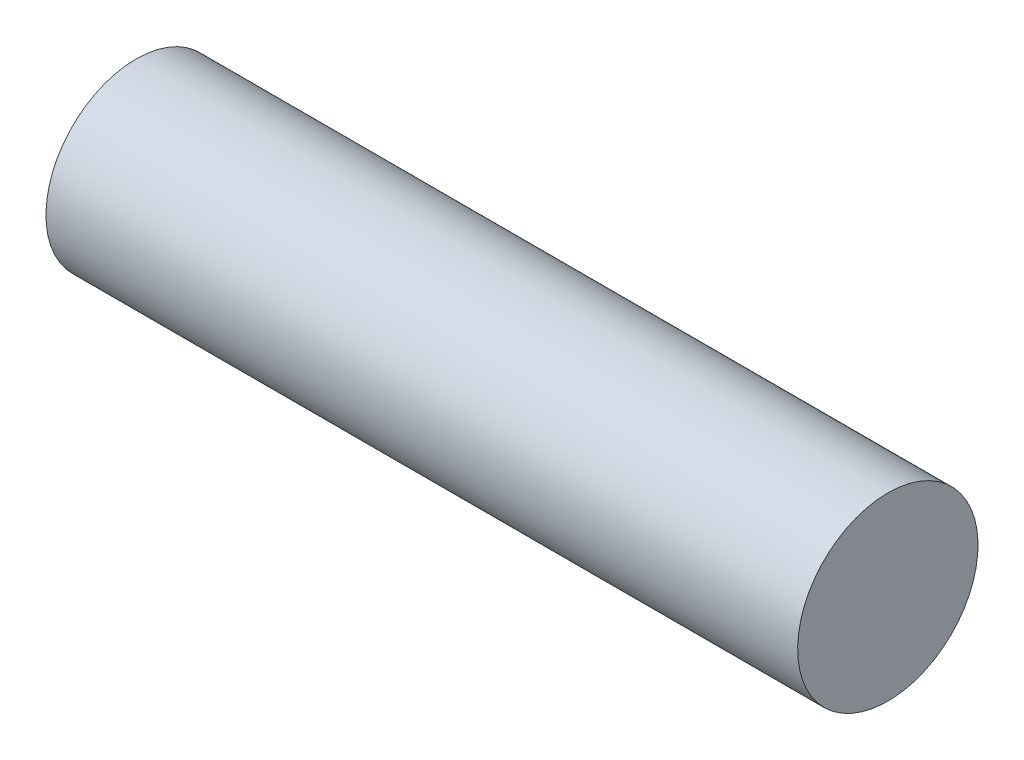
ISO-10303-21;
HEADER;
FILE_DESCRIPTION(('STEP AP214'),'2;1');
FILE_NAME('part.step','',(''),(''),'','','');
FILE_SCHEMA(('AUTOMOTIVE_DESIGN { 1 0 10303 214 1 1 1 1 }'));
ENDSEC;
DATA;
#1=APPLICATION_CONTEXT('core data for automotive mechanical design processes');
#2=APPLICATION_PROTOCOL_DEFINITION('international standard','automotive_design',2000,#1);
#3=PRODUCT_CONTEXT('',#1,'mechanical');
#4=PRODUCT('Part','Part','',(#3));
#5=PRODUCT_RELATED_PRODUCT_CATEGORY('part','',(#4));
#6=PRODUCT_DEFINITION_FORMATION('','',#4);
#7=PRODUCT_DEFINITION_CONTEXT('part definition',#1,'design');
#8=PRODUCT_DEFINITION('design','',#6,#7);
#9=PRODUCT_DEFINITION_SHAPE('','',#8);
#10=(LENGTH_UNIT() NAMED_UNIT(*) SI_UNIT(.MILLI.,.METRE.));
#11=(NAMED_UNIT(*) PLANE_ANGLE_UNIT() SI_UNIT($,.RADIAN.));
#12=(NAMED_UNIT(*) SI_UNIT($,.STERADIAN.) SOLID_ANGLE_UNIT());
#13=UNCERTAINTY_MEASURE_WITH_UNIT(LENGTH_MEASURE(1.E-05),#10,'distance_accuracy_value','');
#14=(GEOMETRIC_REPRESENTATION_CONTEXT(3) GLOBAL_UNCERTAINTY_ASSIGNED_CONTEXT((#13)) GLOBAL_UNIT_ASSIGNED_CONTEXT((#10,
#11,#12)) REPRESENTATION_CONTEXT('',''));
#15=CARTESIAN_POINT('',(0.,0.,0.));
#16=DIRECTION('',(0.,0.,1.));
#17=DIRECTION('',(1.,0.,0.));
#18=AXIS2_PLACEMENT_3D('',#15,#16,#17);
#19=CARTESIAN_POINT('',(0.,0.,0.));
#20=DIRECTION('',(1.,0.,0.));
#21=DIRECTION('',(0.,0.,-1.));
#22=AXIS2_PLACEMENT_3D('',#19,#20,#21);
#23=PLANE('',#22);
#24=CARTESIAN_POINT('',(0.,0.,0.));
#25=DIRECTION('',(-1.,0.,0.));
#26=DIRECTION('',(0.,0.,1.));
#27=AXIS2_PLACEMENT_3D('',#24,#25,#26);
#28=CIRCLE('',#27,6.);
#29=CARTESIAN_POINT('',(0.,6.,-4.30775163580993E-08));
#30=VERTEX_POINT('',#29);
#31=CARTESIAN_POINT('',(0.,6.,0.));
#32=VERTEX_POINT('',#31);
#33=EDGE_CURVE('E11',#30,#32,#28,.T.);
#34=ORIENTED_EDGE('',*,*,#33,.T.);
#35=DIRECTION('',(0.,-1.,0.));
#36=VECTOR('',#35,1.);
#37=CARTESIAN_POINT('',(0.,0.,0.));
#38=LINE('',#37,#36);
#39=CARTESIAN_POINT('',(0.,0.,0.));
#40=VERTEX_POINT('',#39);
#41=EDGE_CURVE('E55',#32,#40,#38,.T.);
#42=ORIENTED_EDGE('',*,*,#41,.T.);
#43=DIRECTION('',(0.,-1.,7.17958605968322E-09));
#44=VECTOR('',#43,1.);
#45=CARTESIAN_POINT('',(0.,0.,0.));
#46=LINE('',#45,#44);
#47=EDGE_CURVE('E76',#30,#40,#46,.T.);
#48=ORIENTED_EDGE('',*,*,#47,.F.);
#49=EDGE_LOOP('',(#34,#42,#48));
#50=FACE_BOUND('',#49,.T.);
#51=ADVANCED_FACE('F39',(#50),#23,.F.);
#52=CARTESIAN_POINT('',(0.,0.,0.));
#53=DIRECTION('',(-1.,0.,0.));
#54=DIRECTION('',(0.,0.,1.));
#55=AXIS2_PLACEMENT_3D('',#52,#53,#54);
#56=CYLINDRICAL_SURFACE('',#55,6.);
#57=CARTESIAN_POINT('',(50.,0.,0.));
#58=DIRECTION('',(-1.,0.,0.));
#59=DIRECTION('',(0.,0.,1.));
#60=AXIS2_PLACEMENT_3D('',#57,#58,#59);
#61=CIRCLE('',#60,6.);
#62=CARTESIAN_POINT('',(50.,6.,-4.30775163580993E-08));
#63=VERTEX_POINT('',#62);
#64=CARTESIAN_POINT('',(50.,6.,0.));
#65=VERTEX_POINT('',#64);
#66=EDGE_CURVE('E46',#63,#65,#61,.T.);
#67=ORIENTED_EDGE('',*,*,#66,.T.);
#68=DIRECTION('',(-1.,0.,0.));
#69=VECTOR('',#68,1.);
#70=CARTESIAN_POINT('',(0.,6.,0.));
#71=LINE('',#70,#69);
#72=EDGE_CURVE('E74',#65,#32,#71,.T.);
#73=ORIENTED_EDGE('',*,*,#72,.T.);
#74=ORIENTED_EDGE('',*,*,#33,.F.);
#75=DIRECTION('',(-1.,0.,0.));
#76=VECTOR('',#75,1.);
#77=CARTESIAN_POINT('',(0.,6.,-4.30775163580993E-08));
#78=LINE('',#77,#76);
#79=EDGE_CURVE('E73',#63,#30,#78,.T.);
#80=ORIENTED_EDGE('',*,*,#79,.F.);
#81=EDGE_LOOP('',(#67,#73,#74,#80));
#82=FACE_BOUND('',#81,.T.);
#83=ADVANCED_FACE('F71',(#82),#56,.T.);
#84=CARTESIAN_POINT('',(50.,6.,-4.30775163580993E-08));
#85=DIRECTION('',(-1.,0.,0.));
#86=DIRECTION('',(0.,0.,1.));
#87=AXIS2_PLACEMENT_3D('',#84,#85,#86);
#88=PLANE('',#87);
#89=DIRECTION('',(0.,1.,-7.17958605968322E-09));
#90=VECTOR('',#89,1.);
#91=CARTESIAN_POINT('',(50.,6.,-4.30775163580993E-08));
#92=LINE('',#91,#90);
#93=CARTESIAN_POINT('',(50.,0.,0.));
#94=VERTEX_POINT('',#93);
#95=EDGE_CURVE('E85',#94,#63,#92,.T.);
#96=ORIENTED_EDGE('',*,*,#95,.F.);
#97=DIRECTION('',(0.,1.,0.));
#98=VECTOR('',#97,1.);
#99=CARTESIAN_POINT('',(50.,6.,0.));
#100=LINE('',#99,#98);
#101=EDGE_CURVE('E79',#94,#65,#100,.T.);
#102=ORIENTED_EDGE('',*,*,#101,.T.);
#103=ORIENTED_EDGE('',*,*,#66,.F.);
#104=EDGE_LOOP('',(#96,#102,#103));
#105=FACE_BOUND('',#104,.T.);
#106=ADVANCED_FACE('F83',(#105),#88,.F.);
#107=CARTESIAN_POINT('',(0.,0.,0.));
#108=DIRECTION('',(0.,-7.17958605968322E-09,-1.));
#109=DIRECTION('',(-1.,0.,0.));
#110=AXIS2_PLACEMENT_3D('',#107,#108,#109);
#111=PLANE('',#110);
#112=DIRECTION('',(1.,0.,0.));
#113=VECTOR('',#112,1.);
#114=CARTESIAN_POINT('',(50.,0.,0.));
#115=LINE('',#114,#113);
#116=EDGE_CURVE('E88',#40,#94,#115,.T.);
#117=ORIENTED_EDGE('',*,*,#116,.T.);
#118=ORIENTED_EDGE('',*,*,#95,.T.);
#119=ORIENTED_EDGE('',*,*,#79,.T.);
#120=ORIENTED_EDGE('',*,*,#47,.T.);
#121=EDGE_LOOP('',(#117,#118,#119,#120));
#122=FACE_BOUND('',#121,.T.);
#123=ADVANCED_FACE('F94',(#122),#111,.F.);
#124=CARTESIAN_POINT('',(0.,0.,0.));
#125=DIRECTION('',(0.,0.,-1.));
#126=DIRECTION('',(-1.,0.,0.));
#127=AXIS2_PLACEMENT_3D('',#124,#125,#126);
#128=PLANE('',#127);
#129=ORIENTED_EDGE('',*,*,#116,.F.);
#130=ORIENTED_EDGE('',*,*,#41,.F.);
#131=ORIENTED_EDGE('',*,*,#72,.F.);
#132=ORIENTED_EDGE('',*,*,#101,.F.);
#133=EDGE_LOOP('',(#129,#130,#131,#132));
#134=FACE_BOUND('',#133,.T.);
#135=ADVANCED_FACE('F86',(#134),#128,.T.);
#136=CLOSED_SHELL('',(#51,#83,#106,#123,#135));
#137=MANIFOLD_SOLID_BREP('B2',#136);
#138=ADVANCED_BREP_SHAPE_REPRESENTATION('',(#18,#137),#14);
#139=SHAPE_DEFINITION_REPRESENTATION(#9,#138);
ENDSEC;
END-ISO-10303-21;
